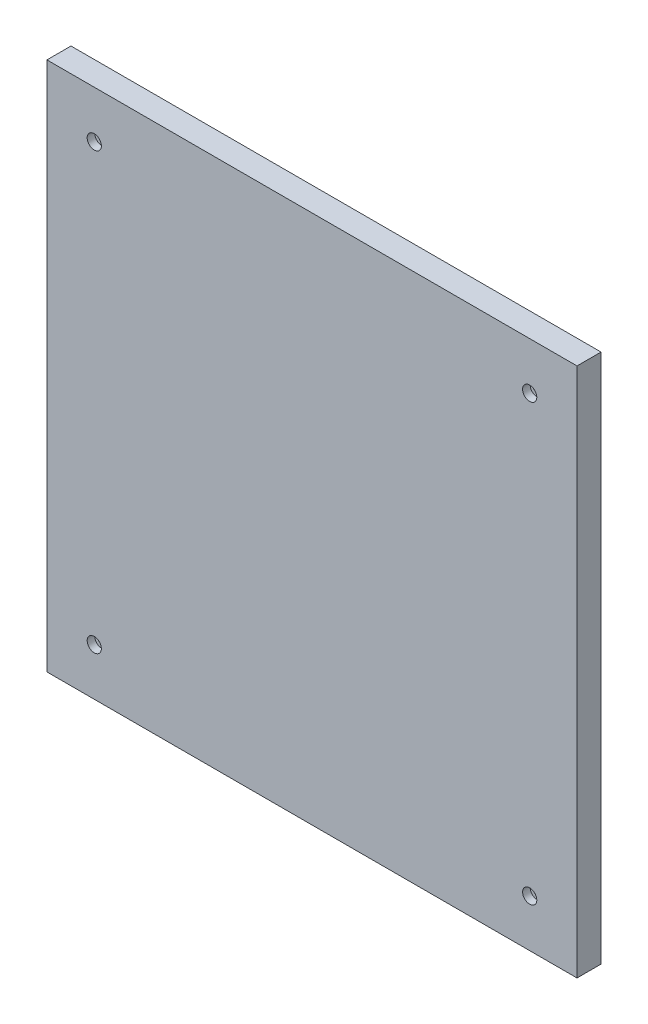
ISO-10303-21;
HEADER;
FILE_DESCRIPTION(('STEP AP214'),'2;1');
FILE_NAME('part.step','',(''),(''),'','','');
FILE_SCHEMA(('AUTOMOTIVE_DESIGN { 1 0 10303 214 1 1 1 1 }'));
ENDSEC;
DATA;
#1=APPLICATION_CONTEXT('core data for automotive mechanical design processes');
#2=APPLICATION_PROTOCOL_DEFINITION('international standard','automotive_design',2000,#1);
#3=PRODUCT_CONTEXT('',#1,'mechanical');
#4=PRODUCT('Part','Part','',(#3));
#5=PRODUCT_RELATED_PRODUCT_CATEGORY('part','',(#4));
#6=PRODUCT_DEFINITION_FORMATION('','',#4);
#7=PRODUCT_DEFINITION_CONTEXT('part definition',#1,'design');
#8=PRODUCT_DEFINITION('design','',#6,#7);
#9=PRODUCT_DEFINITION_SHAPE('','',#8);
#10=(LENGTH_UNIT() NAMED_UNIT(*) SI_UNIT(.MILLI.,.METRE.));
#11=(NAMED_UNIT(*) PLANE_ANGLE_UNIT() SI_UNIT($,.RADIAN.));
#12=(NAMED_UNIT(*) SI_UNIT($,.STERADIAN.) SOLID_ANGLE_UNIT());
#13=UNCERTAINTY_MEASURE_WITH_UNIT(LENGTH_MEASURE(1.E-05),#10,'distance_accuracy_value','');
#14=(GEOMETRIC_REPRESENTATION_CONTEXT(3) GLOBAL_UNCERTAINTY_ASSIGNED_CONTEXT((#13)) GLOBAL_UNIT_ASSIGNED_CONTEXT((#10,
#11,#12)) REPRESENTATION_CONTEXT('',''));
#15=CARTESIAN_POINT('',(0.,0.,0.));
#16=DIRECTION('',(0.,0.,1.));
#17=DIRECTION('',(1.,0.,0.));
#18=AXIS2_PLACEMENT_3D('',#15,#16,#17);
#19=CARTESIAN_POINT('',(209.065660481465,217.017007569258,12.7));
#20=DIRECTION('',(0.,0.,-1.));
#21=DIRECTION('',(-1.,0.,0.));
#22=AXIS2_PLACEMENT_3D('',#19,#20,#21);
#23=CYLINDRICAL_SURFACE('',#22,2.);
#24=CARTESIAN_POINT('',(209.065660481465,217.017007569258,0.));
#25=DIRECTION('',(0.,0.,1.));
#26=DIRECTION('',(1.,0.,0.));
#27=AXIS2_PLACEMENT_3D('',#24,#25,#26);
#28=CIRCLE('',#27,2.);
#29=CARTESIAN_POINT('',(211.065660481465,217.017007569258,0.));
#30=VERTEX_POINT('',#29);
#31=EDGE_CURVE('E108',#30,#30,#28,.T.);
#32=ORIENTED_EDGE('',*,*,#31,.F.);
#33=EDGE_LOOP('',(#32));
#34=FACE_BOUND('',#33,.T.);
#35=CARTESIAN_POINT('',(209.065660481465,217.017007569258,8.7));
#36=DIRECTION('',(0.,0.,1.));
#37=DIRECTION('',(1.,0.,0.));
#38=AXIS2_PLACEMENT_3D('',#35,#36,#37);
#39=CIRCLE('',#38,2.);
#40=CARTESIAN_POINT('',(211.065660481465,217.017007569258,8.7));
#41=VERTEX_POINT('',#40);
#42=EDGE_CURVE('E42',#41,#41,#39,.T.);
#43=ORIENTED_EDGE('',*,*,#42,.T.);
#44=EDGE_LOOP('',(#43));
#45=FACE_BOUND('',#44,.T.);
#46=ADVANCED_FACE('F38',(#34,#45),#23,.F.);
#47=CARTESIAN_POINT('',(439.065660481464,217.017007569258,12.7));
#48=DIRECTION('',(0.,0.,-1.));
#49=DIRECTION('',(-1.,0.,0.));
#50=AXIS2_PLACEMENT_3D('',#47,#48,#49);
#51=CYLINDRICAL_SURFACE('',#50,2.);
#52=CARTESIAN_POINT('',(439.065660481464,217.017007569258,0.));
#53=DIRECTION('',(0.,0.,1.));
#54=DIRECTION('',(1.,0.,0.));
#55=AXIS2_PLACEMENT_3D('',#52,#53,#54);
#56=CIRCLE('',#55,2.);
#57=CARTESIAN_POINT('',(441.065660481464,217.017007569258,0.));
#58=VERTEX_POINT('',#57);
#59=EDGE_CURVE('E134',#58,#58,#56,.T.);
#60=ORIENTED_EDGE('',*,*,#59,.F.);
#61=EDGE_LOOP('',(#60));
#62=FACE_BOUND('',#61,.T.);
#63=CARTESIAN_POINT('',(439.065660481464,217.017007569258,8.7));
#64=DIRECTION('',(0.,0.,1.));
#65=DIRECTION('',(1.,0.,0.));
#66=AXIS2_PLACEMENT_3D('',#63,#64,#65);
#67=CIRCLE('',#66,2.);
#68=CARTESIAN_POINT('',(441.065660481464,217.017007569258,8.7));
#69=VERTEX_POINT('',#68);
#70=EDGE_CURVE('E120',#69,#69,#67,.T.);
#71=ORIENTED_EDGE('',*,*,#70,.T.);
#72=EDGE_LOOP('',(#71));
#73=FACE_BOUND('',#72,.T.);
#74=ADVANCED_FACE('F149',(#62,#73),#51,.F.);
#75=CARTESIAN_POINT('',(439.065660481465,-12.9829924307394,12.7));
#76=DIRECTION('',(0.,0.,-1.));
#77=DIRECTION('',(-1.,0.,0.));
#78=AXIS2_PLACEMENT_3D('',#75,#76,#77);
#79=CYLINDRICAL_SURFACE('',#78,2.);
#80=CARTESIAN_POINT('',(439.065660481465,-12.9829924307394,0.));
#81=DIRECTION('',(0.,0.,1.));
#82=DIRECTION('',(1.,0.,0.));
#83=AXIS2_PLACEMENT_3D('',#80,#81,#82);
#84=CIRCLE('',#83,2.);
#85=CARTESIAN_POINT('',(441.065660481465,-12.9829924307394,0.));
#86=VERTEX_POINT('',#85);
#87=EDGE_CURVE('E129',#86,#86,#84,.T.);
#88=ORIENTED_EDGE('',*,*,#87,.F.);
#89=EDGE_LOOP('',(#88));
#90=FACE_BOUND('',#89,.T.);
#91=CARTESIAN_POINT('',(439.065660481465,-12.9829924307394,8.7));
#92=DIRECTION('',(0.,0.,1.));
#93=DIRECTION('',(1.,0.,0.));
#94=AXIS2_PLACEMENT_3D('',#91,#92,#93);
#95=CIRCLE('',#94,2.);
#96=CARTESIAN_POINT('',(441.065660481465,-12.9829924307394,8.7));
#97=VERTEX_POINT('',#96);
#98=EDGE_CURVE('E117',#97,#97,#95,.T.);
#99=ORIENTED_EDGE('',*,*,#98,.T.);
#100=EDGE_LOOP('',(#99));
#101=FACE_BOUND('',#100,.T.);
#102=ADVANCED_FACE('F154',(#90,#101),#79,.F.);
#103=CARTESIAN_POINT('',(209.065660481466,-12.9829924307411,12.7));
#104=DIRECTION('',(0.,0.,-1.));
#105=DIRECTION('',(-1.,0.,0.));
#106=AXIS2_PLACEMENT_3D('',#103,#104,#105);
#107=CYLINDRICAL_SURFACE('',#106,2.);
#108=CARTESIAN_POINT('',(209.065660481466,-12.9829924307411,0.));
#109=DIRECTION('',(0.,0.,1.));
#110=DIRECTION('',(1.,0.,0.));
#111=AXIS2_PLACEMENT_3D('',#108,#109,#110);
#112=CIRCLE('',#111,2.);
#113=CARTESIAN_POINT('',(211.065660481466,-12.9829924307411,0.));
#114=VERTEX_POINT('',#113);
#115=EDGE_CURVE('E125',#114,#114,#112,.T.);
#116=ORIENTED_EDGE('',*,*,#115,.F.);
#117=EDGE_LOOP('',(#116));
#118=FACE_BOUND('',#117,.T.);
#119=CARTESIAN_POINT('',(209.065660481466,-12.9829924307411,8.7));
#120=DIRECTION('',(0.,0.,1.));
#121=DIRECTION('',(1.,0.,0.));
#122=AXIS2_PLACEMENT_3D('',#119,#120,#121);
#123=CIRCLE('',#122,2.);
#124=CARTESIAN_POINT('',(211.065660481466,-12.9829924307411,8.7));
#125=VERTEX_POINT('',#124);
#126=EDGE_CURVE('E114',#125,#125,#123,.T.);
#127=ORIENTED_EDGE('',*,*,#126,.T.);
#128=EDGE_LOOP('',(#127));
#129=FACE_BOUND('',#128,.T.);
#130=ADVANCED_FACE('F161',(#118,#129),#107,.F.);
#131=CARTESIAN_POINT('',(0.,0.,12.7));
#132=DIRECTION('',(0.,0.,1.));
#133=DIRECTION('',(1.,0.,0.));
#134=AXIS2_PLACEMENT_3D('',#131,#132,#133);
#135=PLANE('',#134);
#136=CARTESIAN_POINT('',(439.065660481465,-12.9829924307394,12.7));
#137=DIRECTION('',(0.,0.,1.));
#138=DIRECTION('',(1.,0.,0.));
#139=AXIS2_PLACEMENT_3D('',#136,#137,#138);
#140=CIRCLE('',#139,3.74999999999998);
#141=CARTESIAN_POINT('',(442.815660481465,-12.9829924307394,12.7));
#142=VERTEX_POINT('',#141);
#143=EDGE_CURVE('E368',#142,#142,#140,.T.);
#144=ORIENTED_EDGE('',*,*,#143,.F.);
#145=EDGE_LOOP('',(#144));
#146=FACE_BOUND('',#145,.T.);
#147=CARTESIAN_POINT('',(439.065660481464,217.017007569258,12.7));
#148=DIRECTION('',(0.,0.,1.));
#149=DIRECTION('',(1.,0.,0.));
#150=AXIS2_PLACEMENT_3D('',#147,#148,#149);
#151=CIRCLE('',#150,3.74999999999998);
#152=CARTESIAN_POINT('',(442.815660481464,217.017007569258,12.7));
#153=VERTEX_POINT('',#152);
#154=EDGE_CURVE('E358',#153,#153,#151,.T.);
#155=ORIENTED_EDGE('',*,*,#154,.F.);
#156=EDGE_LOOP('',(#155));
#157=FACE_BOUND('',#156,.T.);
#158=CARTESIAN_POINT('',(209.065660481465,217.017007569258,12.7));
#159=DIRECTION('',(0.,0.,1.));
#160=DIRECTION('',(1.,0.,0.));
#161=AXIS2_PLACEMENT_3D('',#158,#159,#160);
#162=CIRCLE('',#161,3.75000000000001);
#163=CARTESIAN_POINT('',(212.815660481465,217.017007569258,12.7));
#164=VERTEX_POINT('',#163);
#165=EDGE_CURVE('E357',#164,#164,#162,.T.);
#166=ORIENTED_EDGE('',*,*,#165,.F.);
#167=EDGE_LOOP('',(#166));
#168=FACE_BOUND('',#167,.T.);
#169=CARTESIAN_POINT('',(209.065660481466,-12.9829924307411,12.7));
#170=DIRECTION('',(0.,0.,1.));
#171=DIRECTION('',(1.,0.,0.));
#172=AXIS2_PLACEMENT_3D('',#169,#170,#171);
#173=CIRCLE('',#172,3.75000000000001);
#174=CARTESIAN_POINT('',(212.815660481466,-12.9829924307411,12.7));
#175=VERTEX_POINT('',#174);
#176=EDGE_CURVE('E137',#175,#175,#173,.T.);
#177=ORIENTED_EDGE('',*,*,#176,.F.);
#178=EDGE_LOOP('',(#177));
#179=FACE_BOUND('',#178,.T.);
#180=DIRECTION('',(0.,-1.,0.));
#181=VECTOR('',#180,1.);
#182=CARTESIAN_POINT('',(184.065660481465,242.017007569259,12.7));
#183=LINE('',#182,#181);
#184=CARTESIAN_POINT('',(184.065660481465,242.017007569259,12.7));
#185=VERTEX_POINT('',#184);
#186=CARTESIAN_POINT('',(184.065660481465,-37.9829924307426,12.7));
#187=VERTEX_POINT('',#186);
#188=EDGE_CURVE('E92',#185,#187,#183,.T.);
#189=ORIENTED_EDGE('',*,*,#188,.T.);
#190=DIRECTION('',(1.,0.,0.));
#191=VECTOR('',#190,1.);
#192=CARTESIAN_POINT('',(184.065660481465,-37.9829924307426,12.7));
#193=LINE('',#192,#191);
#194=CARTESIAN_POINT('',(464.065660481463,-37.9829924307426,12.7));
#195=VERTEX_POINT('',#194);
#196=EDGE_CURVE('E87',#187,#195,#193,.T.);
#197=ORIENTED_EDGE('',*,*,#196,.T.);
#198=DIRECTION('',(0.,1.,0.));
#199=VECTOR('',#198,1.);
#200=CARTESIAN_POINT('',(464.065660481463,242.017007569259,12.7));
#201=LINE('',#200,#199);
#202=CARTESIAN_POINT('',(464.065660481463,242.017007569259,12.7));
#203=VERTEX_POINT('',#202);
#204=EDGE_CURVE('E90',#195,#203,#201,.T.);
#205=ORIENTED_EDGE('',*,*,#204,.T.);
#206=DIRECTION('',(-1.,0.,0.));
#207=VECTOR('',#206,1.);
#208=CARTESIAN_POINT('',(184.065660481465,242.017007569259,12.7));
#209=LINE('',#208,#207);
#210=EDGE_CURVE('E57',#203,#185,#209,.T.);
#211=ORIENTED_EDGE('',*,*,#210,.T.);
#212=EDGE_LOOP('',(#189,#197,#205,#211));
#213=FACE_BOUND('',#212,.T.);
#214=ADVANCED_FACE('F88',(#146,#157,#168,#179,#213),#135,.T.);
#215=CARTESIAN_POINT('',(0.,0.,0.));
#216=DIRECTION('',(0.,0.,1.));
#217=DIRECTION('',(1.,0.,0.));
#218=AXIS2_PLACEMENT_3D('',#215,#216,#217);
#219=PLANE('',#218);
#220=DIRECTION('',(0.,-1.,0.));
#221=VECTOR('',#220,1.);
#222=CARTESIAN_POINT('',(184.065660481465,242.017007569259,0.));
#223=LINE('',#222,#221);
#224=CARTESIAN_POINT('',(184.065660481465,242.017007569259,0.));
#225=VERTEX_POINT('',#224);
#226=CARTESIAN_POINT('',(184.065660481465,-37.9829924307426,0.));
#227=VERTEX_POINT('',#226);
#228=EDGE_CURVE('E105',#225,#227,#223,.T.);
#229=ORIENTED_EDGE('',*,*,#228,.F.);
#230=DIRECTION('',(-1.,0.,0.));
#231=VECTOR('',#230,1.);
#232=CARTESIAN_POINT('',(184.065660481465,242.017007569259,0.));
#233=LINE('',#232,#231);
#234=CARTESIAN_POINT('',(464.065660481463,242.017007569259,0.));
#235=VERTEX_POINT('',#234);
#236=EDGE_CURVE('E80',#235,#225,#233,.T.);
#237=ORIENTED_EDGE('',*,*,#236,.F.);
#238=DIRECTION('',(0.,1.,0.));
#239=VECTOR('',#238,1.);
#240=CARTESIAN_POINT('',(464.065660481463,242.017007569259,0.));
#241=LINE('',#240,#239);
#242=CARTESIAN_POINT('',(464.065660481463,-37.9829924307426,0.));
#243=VERTEX_POINT('',#242);
#244=EDGE_CURVE('E74',#243,#235,#241,.T.);
#245=ORIENTED_EDGE('',*,*,#244,.F.);
#246=DIRECTION('',(1.,0.,0.));
#247=VECTOR('',#246,1.);
#248=CARTESIAN_POINT('',(184.065660481465,-37.9829924307426,0.));
#249=LINE('',#248,#247);
#250=EDGE_CURVE('E96',#227,#243,#249,.T.);
#251=ORIENTED_EDGE('',*,*,#250,.F.);
#252=EDGE_LOOP('',(#229,#237,#245,#251));
#253=FACE_BOUND('',#252,.T.);
#254=ORIENTED_EDGE('',*,*,#31,.T.);
#255=EDGE_LOOP('',(#254));
#256=FACE_BOUND('',#255,.T.);
#257=ORIENTED_EDGE('',*,*,#59,.T.);
#258=EDGE_LOOP('',(#257));
#259=FACE_BOUND('',#258,.T.);
#260=ORIENTED_EDGE('',*,*,#87,.T.);
#261=EDGE_LOOP('',(#260));
#262=FACE_BOUND('',#261,.T.);
#263=ORIENTED_EDGE('',*,*,#115,.T.);
#264=EDGE_LOOP('',(#263));
#265=FACE_BOUND('',#264,.T.);
#266=ADVANCED_FACE('F145',(#253,#256,#259,#262,#265),#219,.F.);
#267=CARTESIAN_POINT('',(184.065660481465,242.017007569259,12.7));
#268=DIRECTION('',(1.,0.,0.));
#269=DIRECTION('',(0.,0.,-1.));
#270=AXIS2_PLACEMENT_3D('',#267,#268,#269);
#271=PLANE('',#270);
#272=ORIENTED_EDGE('',*,*,#228,.T.);
#273=DIRECTION('',(0.,0.,-1.));
#274=VECTOR('',#273,1.);
#275=CARTESIAN_POINT('',(184.065660481465,-37.9829924307426,12.7));
#276=LINE('',#275,#274);
#277=EDGE_CURVE('E11',#187,#227,#276,.T.);
#278=ORIENTED_EDGE('',*,*,#277,.F.);
#279=ORIENTED_EDGE('',*,*,#188,.F.);
#280=DIRECTION('',(0.,0.,-1.));
#281=VECTOR('',#280,1.);
#282=CARTESIAN_POINT('',(184.065660481465,242.017007569259,12.7));
#283=LINE('',#282,#281);
#284=EDGE_CURVE('E101',#185,#225,#283,.T.);
#285=ORIENTED_EDGE('',*,*,#284,.T.);
#286=EDGE_LOOP('',(#272,#278,#279,#285));
#287=FACE_BOUND('',#286,.T.);
#288=ADVANCED_FACE('F40',(#287),#271,.F.);
#289=CARTESIAN_POINT('',(184.065660481465,-37.9829924307426,12.7));
#290=DIRECTION('',(0.,1.,0.));
#291=DIRECTION('',(0.,0.,1.));
#292=AXIS2_PLACEMENT_3D('',#289,#290,#291);
#293=PLANE('',#292);
#294=ORIENTED_EDGE('',*,*,#250,.T.);
#295=DIRECTION('',(0.,0.,-1.));
#296=VECTOR('',#295,1.);
#297=CARTESIAN_POINT('',(464.065660481463,-37.9829924307426,12.7));
#298=LINE('',#297,#296);
#299=EDGE_CURVE('E48',#195,#243,#298,.T.);
#300=ORIENTED_EDGE('',*,*,#299,.F.);
#301=ORIENTED_EDGE('',*,*,#196,.F.);
#302=ORIENTED_EDGE('',*,*,#277,.T.);
#303=EDGE_LOOP('',(#294,#300,#301,#302));
#304=FACE_BOUND('',#303,.T.);
#305=ADVANCED_FACE('F95',(#304),#293,.F.);
#306=CARTESIAN_POINT('',(464.065660481463,242.017007569259,12.7));
#307=DIRECTION('',(-1.,0.,0.));
#308=DIRECTION('',(0.,0.,1.));
#309=AXIS2_PLACEMENT_3D('',#306,#307,#308);
#310=PLANE('',#309);
#311=ORIENTED_EDGE('',*,*,#244,.T.);
#312=DIRECTION('',(0.,0.,-1.));
#313=VECTOR('',#312,1.);
#314=CARTESIAN_POINT('',(464.065660481463,242.017007569259,12.7));
#315=LINE('',#314,#313);
#316=EDGE_CURVE('E97',#203,#235,#315,.T.);
#317=ORIENTED_EDGE('',*,*,#316,.F.);
#318=ORIENTED_EDGE('',*,*,#204,.F.);
#319=ORIENTED_EDGE('',*,*,#299,.T.);
#320=EDGE_LOOP('',(#311,#317,#318,#319));
#321=FACE_BOUND('',#320,.T.);
#322=ADVANCED_FACE('F99',(#321),#310,.F.);
#323=CARTESIAN_POINT('',(184.065660481465,242.017007569259,12.7));
#324=DIRECTION('',(0.,-1.,0.));
#325=DIRECTION('',(0.,0.,-1.));
#326=AXIS2_PLACEMENT_3D('',#323,#324,#325);
#327=PLANE('',#326);
#328=ORIENTED_EDGE('',*,*,#236,.T.);
#329=ORIENTED_EDGE('',*,*,#284,.F.);
#330=ORIENTED_EDGE('',*,*,#210,.F.);
#331=ORIENTED_EDGE('',*,*,#316,.T.);
#332=EDGE_LOOP('',(#328,#329,#330,#331));
#333=FACE_BOUND('',#332,.T.);
#334=ADVANCED_FACE('F166',(#333),#327,.F.);
#335=CARTESIAN_POINT('',(209.065660481466,-12.9829924307411,8.7));
#336=DIRECTION('',(0.,0.,1.));
#337=DIRECTION('',(1.,0.,0.));
#338=AXIS2_PLACEMENT_3D('',#335,#336,#337);
#339=CYLINDRICAL_SURFACE('',#338,3.75000000000001);
#340=CARTESIAN_POINT('',(209.065660481466,-12.9829924307411,8.7));
#341=DIRECTION('',(0.,0.,1.));
#342=DIRECTION('',(1.,0.,0.));
#343=AXIS2_PLACEMENT_3D('',#340,#341,#342);
#344=CIRCLE('',#343,3.75000000000001);
#345=CARTESIAN_POINT('',(212.815660481466,-12.9829924307411,8.7));
#346=VERTEX_POINT('',#345);
#347=EDGE_CURVE('E118',#346,#346,#344,.T.);
#348=ORIENTED_EDGE('',*,*,#347,.F.);
#349=EDGE_LOOP('',(#348));
#350=FACE_BOUND('',#349,.T.);
#351=ORIENTED_EDGE('',*,*,#176,.T.);
#352=EDGE_LOOP('',(#351));
#353=FACE_BOUND('',#352,.T.);
#354=ADVANCED_FACE('F169',(#350,#353),#339,.F.);
#355=CARTESIAN_POINT('',(209.065660481466,-12.9829924307411,8.7));
#356=DIRECTION('',(0.,0.,1.));
#357=DIRECTION('',(1.,0.,0.));
#358=AXIS2_PLACEMENT_3D('',#355,#356,#357);
#359=PLANE('',#358);
#360=ORIENTED_EDGE('',*,*,#126,.F.);
#361=EDGE_LOOP('',(#360));
#362=FACE_BOUND('',#361,.T.);
#363=ORIENTED_EDGE('',*,*,#347,.T.);
#364=EDGE_LOOP('',(#363));
#365=FACE_BOUND('',#364,.T.);
#366=ADVANCED_FACE('F265',(#362,#365),#359,.T.);
#367=CARTESIAN_POINT('',(439.065660481465,-12.9829924307394,8.7));
#368=DIRECTION('',(0.,0.,1.));
#369=DIRECTION('',(1.,0.,0.));
#370=AXIS2_PLACEMENT_3D('',#367,#368,#369);
#371=CYLINDRICAL_SURFACE('',#370,3.74999999999998);
#372=CARTESIAN_POINT('',(439.065660481465,-12.9829924307394,8.7));
#373=DIRECTION('',(0.,0.,1.));
#374=DIRECTION('',(1.,0.,0.));
#375=AXIS2_PLACEMENT_3D('',#372,#373,#374);
#376=CIRCLE('',#375,3.74999999999998);
#377=CARTESIAN_POINT('',(442.815660481465,-12.9829924307394,8.7));
#378=VERTEX_POINT('',#377);
#379=EDGE_CURVE('E371',#378,#378,#376,.T.);
#380=ORIENTED_EDGE('',*,*,#379,.F.);
#381=EDGE_LOOP('',(#380));
#382=FACE_BOUND('',#381,.T.);
#383=ORIENTED_EDGE('',*,*,#143,.T.);
#384=EDGE_LOOP('',(#383));
#385=FACE_BOUND('',#384,.T.);
#386=ADVANCED_FACE('F276',(#382,#385),#371,.F.);
#387=CARTESIAN_POINT('',(439.065660481465,-12.9829924307394,8.7));
#388=DIRECTION('',(0.,0.,1.));
#389=DIRECTION('',(1.,0.,0.));
#390=AXIS2_PLACEMENT_3D('',#387,#388,#389);
#391=PLANE('',#390);
#392=ORIENTED_EDGE('',*,*,#98,.F.);
#393=EDGE_LOOP('',(#392));
#394=FACE_BOUND('',#393,.T.);
#395=ORIENTED_EDGE('',*,*,#379,.T.);
#396=EDGE_LOOP('',(#395));
#397=FACE_BOUND('',#396,.T.);
#398=ADVANCED_FACE('F287',(#394,#397),#391,.T.);
#399=CARTESIAN_POINT('',(439.065660481464,217.017007569258,8.7));
#400=DIRECTION('',(0.,0.,1.));
#401=DIRECTION('',(1.,0.,0.));
#402=AXIS2_PLACEMENT_3D('',#399,#400,#401);
#403=CYLINDRICAL_SURFACE('',#402,3.74999999999998);
#404=CARTESIAN_POINT('',(439.065660481464,217.017007569258,8.7));
#405=DIRECTION('',(0.,0.,1.));
#406=DIRECTION('',(1.,0.,0.));
#407=AXIS2_PLACEMENT_3D('',#404,#405,#406);
#408=CIRCLE('',#407,3.74999999999998);
#409=CARTESIAN_POINT('',(442.815660481464,217.017007569258,8.7));
#410=VERTEX_POINT('',#409);
#411=EDGE_CURVE('E363',#410,#410,#408,.T.);
#412=ORIENTED_EDGE('',*,*,#411,.F.);
#413=EDGE_LOOP('',(#412));
#414=FACE_BOUND('',#413,.T.);
#415=ORIENTED_EDGE('',*,*,#154,.T.);
#416=EDGE_LOOP('',(#415));
#417=FACE_BOUND('',#416,.T.);
#418=ADVANCED_FACE('F298',(#414,#417),#403,.F.);
#419=CARTESIAN_POINT('',(439.065660481464,217.017007569258,8.7));
#420=DIRECTION('',(0.,0.,1.));
#421=DIRECTION('',(1.,0.,0.));
#422=AXIS2_PLACEMENT_3D('',#419,#420,#421);
#423=PLANE('',#422);
#424=ORIENTED_EDGE('',*,*,#70,.F.);
#425=EDGE_LOOP('',(#424));
#426=FACE_BOUND('',#425,.T.);
#427=ORIENTED_EDGE('',*,*,#411,.T.);
#428=EDGE_LOOP('',(#427));
#429=FACE_BOUND('',#428,.T.);
#430=ADVANCED_FACE('F309',(#426,#429),#423,.T.);
#431=CARTESIAN_POINT('',(209.065660481465,217.017007569258,8.7));
#432=DIRECTION('',(0.,0.,1.));
#433=DIRECTION('',(1.,0.,0.));
#434=AXIS2_PLACEMENT_3D('',#431,#432,#433);
#435=CYLINDRICAL_SURFACE('',#434,3.75000000000001);
#436=CARTESIAN_POINT('',(209.065660481465,217.017007569258,8.7));
#437=DIRECTION('',(0.,0.,1.));
#438=DIRECTION('',(1.,0.,0.));
#439=AXIS2_PLACEMENT_3D('',#436,#437,#438);
#440=CIRCLE('',#439,3.75000000000001);
#441=CARTESIAN_POINT('',(212.815660481465,217.017007569258,8.7));
#442=VERTEX_POINT('',#441);
#443=EDGE_CURVE('E356',#442,#442,#440,.T.);
#444=ORIENTED_EDGE('',*,*,#443,.F.);
#445=EDGE_LOOP('',(#444));
#446=FACE_BOUND('',#445,.T.);
#447=ORIENTED_EDGE('',*,*,#165,.T.);
#448=EDGE_LOOP('',(#447));
#449=FACE_BOUND('',#448,.T.);
#450=ADVANCED_FACE('F320',(#446,#449),#435,.F.);
#451=CARTESIAN_POINT('',(209.065660481465,217.017007569258,8.7));
#452=DIRECTION('',(0.,0.,1.));
#453=DIRECTION('',(1.,0.,0.));
#454=AXIS2_PLACEMENT_3D('',#451,#452,#453);
#455=PLANE('',#454);
#456=ORIENTED_EDGE('',*,*,#42,.F.);
#457=EDGE_LOOP('',(#456));
#458=FACE_BOUND('',#457,.T.);
#459=ORIENTED_EDGE('',*,*,#443,.T.);
#460=EDGE_LOOP('',(#459));
#461=FACE_BOUND('',#460,.T.);
#462=ADVANCED_FACE('F331',(#458,#461),#455,.T.);
#463=CLOSED_SHELL('',(#46,#74,#102,#130,#214,#266,#288,#305,#322,#334,#354,#366,#386,#398,#418,
#430,#450,#462));
#464=MANIFOLD_SOLID_BREP('B2',#463);
#465=ADVANCED_BREP_SHAPE_REPRESENTATION('',(#18,#464),#14);
#466=SHAPE_DEFINITION_REPRESENTATION(#9,#465);
ENDSEC;
END-ISO-10303-21;
